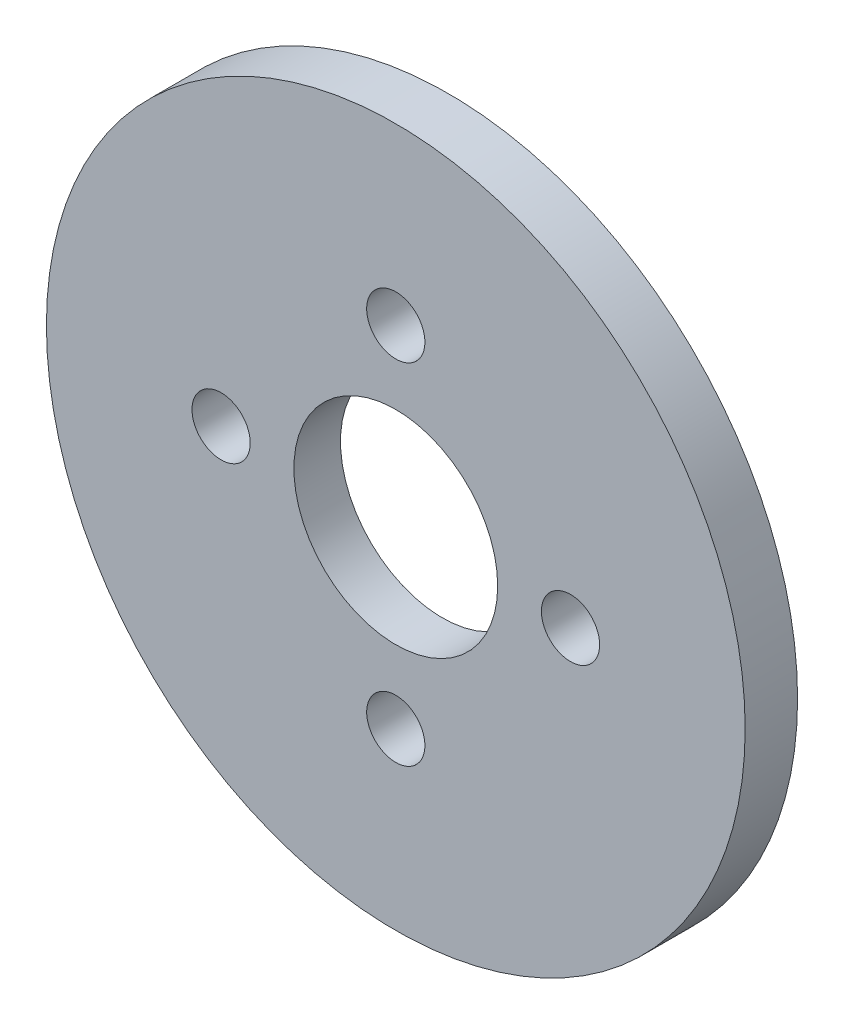
ISO-10303-21;
HEADER;
FILE_DESCRIPTION(('STEP AP214'),'2;1');
FILE_NAME('part.step','',(''),(''),'','','');
FILE_SCHEMA(('AUTOMOTIVE_DESIGN { 1 0 10303 214 1 1 1 1 }'));
ENDSEC;
DATA;
#1=APPLICATION_CONTEXT('core data for automotive mechanical design processes');
#2=APPLICATION_PROTOCOL_DEFINITION('international standard','automotive_design',2000,#1);
#3=PRODUCT_CONTEXT('',#1,'mechanical');
#4=PRODUCT('Part','Part','',(#3));
#5=PRODUCT_RELATED_PRODUCT_CATEGORY('part','',(#4));
#6=PRODUCT_DEFINITION_FORMATION('','',#4);
#7=PRODUCT_DEFINITION_CONTEXT('part definition',#1,'design');
#8=PRODUCT_DEFINITION('design','',#6,#7);
#9=PRODUCT_DEFINITION_SHAPE('','',#8);
#10=(LENGTH_UNIT() NAMED_UNIT(*) SI_UNIT(.MILLI.,.METRE.));
#11=(NAMED_UNIT(*) PLANE_ANGLE_UNIT() SI_UNIT($,.RADIAN.));
#12=(NAMED_UNIT(*) SI_UNIT($,.STERADIAN.) SOLID_ANGLE_UNIT());
#13=UNCERTAINTY_MEASURE_WITH_UNIT(LENGTH_MEASURE(1.E-05),#10,'distance_accuracy_value','');
#14=(GEOMETRIC_REPRESENTATION_CONTEXT(3) GLOBAL_UNCERTAINTY_ASSIGNED_CONTEXT((#13)) GLOBAL_UNIT_ASSIGNED_CONTEXT((#10,
#11,#12)) REPRESENTATION_CONTEXT('',''));
#15=CARTESIAN_POINT('',(0.,0.,0.));
#16=DIRECTION('',(0.,0.,1.));
#17=DIRECTION('',(1.,0.,0.));
#18=AXIS2_PLACEMENT_3D('',#15,#16,#17);
#19=CARTESIAN_POINT('',(0.,0.,0.));
#20=DIRECTION('',(0.,0.,1.));
#21=DIRECTION('',(1.,0.,0.));
#22=AXIS2_PLACEMENT_3D('',#19,#20,#21);
#23=PLANE('',#22);
#24=CARTESIAN_POINT('',(0.,15.,0.));
#25=DIRECTION('',(0.,0.,1.));
#26=DIRECTION('',(1.,0.,0.));
#27=AXIS2_PLACEMENT_3D('',#24,#25,#26);
#28=CIRCLE('',#27,2.5);
#29=CARTESIAN_POINT('',(2.5,15.,0.));
#30=VERTEX_POINT('',#29);
#31=EDGE_CURVE('E92',#30,#30,#28,.T.);
#32=ORIENTED_EDGE('',*,*,#31,.T.);
#33=EDGE_LOOP('',(#32));
#34=FACE_BOUND('',#33,.T.);
#35=CARTESIAN_POINT('',(15.,0.,0.));
#36=DIRECTION('',(0.,0.,1.));
#37=DIRECTION('',(1.,0.,0.));
#38=AXIS2_PLACEMENT_3D('',#35,#36,#37);
#39=CIRCLE('',#38,2.5);
#40=CARTESIAN_POINT('',(17.5,0.,0.));
#41=VERTEX_POINT('',#40);
#42=EDGE_CURVE('E96',#41,#41,#39,.T.);
#43=ORIENTED_EDGE('',*,*,#42,.T.);
#44=EDGE_LOOP('',(#43));
#45=FACE_BOUND('',#44,.T.);
#46=CARTESIAN_POINT('',(0.,-15.,0.));
#47=DIRECTION('',(0.,0.,1.));
#48=DIRECTION('',(1.,0.,0.));
#49=AXIS2_PLACEMENT_3D('',#46,#47,#48);
#50=CIRCLE('',#49,2.5);
#51=CARTESIAN_POINT('',(2.5,-15.,0.));
#52=VERTEX_POINT('',#51);
#53=EDGE_CURVE('E100',#52,#52,#50,.T.);
#54=ORIENTED_EDGE('',*,*,#53,.T.);
#55=EDGE_LOOP('',(#54));
#56=FACE_BOUND('',#55,.T.);
#57=CARTESIAN_POINT('',(-15.,0.,0.));
#58=DIRECTION('',(0.,0.,1.));
#59=DIRECTION('',(1.,0.,0.));
#60=AXIS2_PLACEMENT_3D('',#57,#58,#59);
#61=CIRCLE('',#60,2.5);
#62=CARTESIAN_POINT('',(-12.5,0.,0.));
#63=VERTEX_POINT('',#62);
#64=EDGE_CURVE('E53',#63,#63,#61,.T.);
#65=ORIENTED_EDGE('',*,*,#64,.T.);
#66=EDGE_LOOP('',(#65));
#67=FACE_BOUND('',#66,.T.);
#68=CARTESIAN_POINT('',(0.,0.,0.));
#69=DIRECTION('',(0.,0.,1.));
#70=DIRECTION('',(1.,0.,0.));
#71=AXIS2_PLACEMENT_3D('',#68,#69,#70);
#72=CIRCLE('',#71,8.75);
#73=CARTESIAN_POINT('',(8.75,0.,0.));
#74=VERTEX_POINT('',#73);
#75=EDGE_CURVE('E61',#74,#74,#72,.T.);
#76=ORIENTED_EDGE('',*,*,#75,.T.);
#77=EDGE_LOOP('',(#76));
#78=FACE_BOUND('',#77,.T.);
#79=CARTESIAN_POINT('',(0.,0.,0.));
#80=DIRECTION('',(0.,0.,1.));
#81=DIRECTION('',(1.,0.,0.));
#82=AXIS2_PLACEMENT_3D('',#79,#80,#81);
#83=CIRCLE('',#82,18.);
#84=CARTESIAN_POINT('',(18.,0.,0.));
#85=VERTEX_POINT('',#84);
#86=EDGE_CURVE('E10',#85,#85,#83,.T.);
#87=ORIENTED_EDGE('',*,*,#86,.F.);
#88=EDGE_LOOP('',(#87));
#89=FACE_BOUND('',#88,.T.);
#90=ADVANCED_FACE('F38',(#34,#45,#56,#67,#78,#89),#23,.F.);
#91=CARTESIAN_POINT('',(0.,0.,4.));
#92=DIRECTION('',(0.,0.,1.));
#93=DIRECTION('',(1.,0.,0.));
#94=AXIS2_PLACEMENT_3D('',#91,#92,#93);
#95=PLANE('',#94);
#96=CARTESIAN_POINT('',(0.,15.,4.));
#97=DIRECTION('',(0.,0.,1.));
#98=DIRECTION('',(1.,0.,0.));
#99=AXIS2_PLACEMENT_3D('',#96,#97,#98);
#100=CIRCLE('',#99,2.5);
#101=CARTESIAN_POINT('',(2.5,15.,4.));
#102=VERTEX_POINT('',#101);
#103=EDGE_CURVE('E118',#102,#102,#100,.T.);
#104=ORIENTED_EDGE('',*,*,#103,.F.);
#105=EDGE_LOOP('',(#104));
#106=FACE_BOUND('',#105,.T.);
#107=CARTESIAN_POINT('',(15.,0.,4.));
#108=DIRECTION('',(0.,0.,1.));
#109=DIRECTION('',(1.,0.,0.));
#110=AXIS2_PLACEMENT_3D('',#107,#108,#109);
#111=CIRCLE('',#110,2.5);
#112=CARTESIAN_POINT('',(17.5,0.,4.));
#113=VERTEX_POINT('',#112);
#114=EDGE_CURVE('E114',#113,#113,#111,.T.);
#115=ORIENTED_EDGE('',*,*,#114,.F.);
#116=EDGE_LOOP('',(#115));
#117=FACE_BOUND('',#116,.T.);
#118=CARTESIAN_POINT('',(0.,-15.,4.));
#119=DIRECTION('',(0.,0.,1.));
#120=DIRECTION('',(1.,0.,0.));
#121=AXIS2_PLACEMENT_3D('',#118,#119,#120);
#122=CIRCLE('',#121,2.5);
#123=CARTESIAN_POINT('',(2.5,-15.,4.));
#124=VERTEX_POINT('',#123);
#125=EDGE_CURVE('E108',#124,#124,#122,.T.);
#126=ORIENTED_EDGE('',*,*,#125,.F.);
#127=EDGE_LOOP('',(#126));
#128=FACE_BOUND('',#127,.T.);
#129=CARTESIAN_POINT('',(-15.,0.,4.));
#130=DIRECTION('',(0.,0.,1.));
#131=DIRECTION('',(1.,0.,0.));
#132=AXIS2_PLACEMENT_3D('',#129,#130,#131);
#133=CIRCLE('',#132,2.5);
#134=CARTESIAN_POINT('',(-12.5,0.,4.));
#135=VERTEX_POINT('',#134);
#136=EDGE_CURVE('E104',#135,#135,#133,.T.);
#137=ORIENTED_EDGE('',*,*,#136,.F.);
#138=EDGE_LOOP('',(#137));
#139=FACE_BOUND('',#138,.T.);
#140=CARTESIAN_POINT('',(0.,0.,4.));
#141=DIRECTION('',(0.,0.,1.));
#142=DIRECTION('',(1.,0.,0.));
#143=AXIS2_PLACEMENT_3D('',#140,#141,#142);
#144=CIRCLE('',#143,30.);
#145=CARTESIAN_POINT('',(30.,0.,4.));
#146=VERTEX_POINT('',#145);
#147=EDGE_CURVE('E42',#146,#146,#144,.T.);
#148=ORIENTED_EDGE('',*,*,#147,.T.);
#149=EDGE_LOOP('',(#148));
#150=FACE_BOUND('',#149,.T.);
#151=CARTESIAN_POINT('',(0.,0.,4.));
#152=DIRECTION('',(0.,0.,1.));
#153=DIRECTION('',(1.,0.,0.));
#154=AXIS2_PLACEMENT_3D('',#151,#152,#153);
#155=CIRCLE('',#154,8.75);
#156=CARTESIAN_POINT('',(8.75,0.,4.));
#157=VERTEX_POINT('',#156);
#158=EDGE_CURVE('E50',#157,#157,#155,.T.);
#159=ORIENTED_EDGE('',*,*,#158,.F.);
#160=EDGE_LOOP('',(#159));
#161=FACE_BOUND('',#160,.T.);
#162=ADVANCED_FACE('F80',(#106,#117,#128,#139,#150,#161),#95,.T.);
#163=CARTESIAN_POINT('',(0.,0.,4.));
#164=DIRECTION('',(0.,0.,-1.));
#165=DIRECTION('',(-1.,0.,0.));
#166=AXIS2_PLACEMENT_3D('',#163,#164,#165);
#167=CYLINDRICAL_SURFACE('',#166,30.);
#168=ORIENTED_EDGE('',*,*,#147,.F.);
#169=EDGE_LOOP('',(#168));
#170=FACE_BOUND('',#169,.T.);
#171=CARTESIAN_POINT('',(0.,0.,-0.5));
#172=DIRECTION('',(0.,0.,1.));
#173=DIRECTION('',(1.,0.,0.));
#174=AXIS2_PLACEMENT_3D('',#171,#172,#173);
#175=CIRCLE('',#174,30.);
#176=CARTESIAN_POINT('',(30.,0.,-0.5));
#177=VERTEX_POINT('',#176);
#178=EDGE_CURVE('E58',#177,#177,#175,.T.);
#179=ORIENTED_EDGE('',*,*,#178,.T.);
#180=EDGE_LOOP('',(#179));
#181=FACE_BOUND('',#180,.T.);
#182=ADVANCED_FACE('F40',(#170,#181),#167,.T.);
#183=CARTESIAN_POINT('',(0.,0.,4.));
#184=DIRECTION('',(0.,0.,-1.));
#185=DIRECTION('',(-1.,0.,0.));
#186=AXIS2_PLACEMENT_3D('',#183,#184,#185);
#187=CYLINDRICAL_SURFACE('',#186,8.75);
#188=ORIENTED_EDGE('',*,*,#158,.T.);
#189=EDGE_LOOP('',(#188));
#190=FACE_BOUND('',#189,.T.);
#191=ORIENTED_EDGE('',*,*,#75,.F.);
#192=EDGE_LOOP('',(#191));
#193=FACE_BOUND('',#192,.T.);
#194=ADVANCED_FACE('F68',(#190,#193),#187,.F.);
#195=CARTESIAN_POINT('',(-30.,0.,-0.5));
#196=DIRECTION('',(0.,0.,1.));
#197=DIRECTION('',(1.,0.,0.));
#198=AXIS2_PLACEMENT_3D('',#195,#196,#197);
#199=PLANE('',#198);
#200=ORIENTED_EDGE('',*,*,#178,.F.);
#201=EDGE_LOOP('',(#200));
#202=FACE_BOUND('',#201,.T.);
#203=CARTESIAN_POINT('',(0.,0.,-0.5));
#204=DIRECTION('',(0.,0.,1.));
#205=DIRECTION('',(1.,0.,0.));
#206=AXIS2_PLACEMENT_3D('',#203,#204,#205);
#207=CIRCLE('',#206,20.);
#208=CARTESIAN_POINT('',(20.,0.,-0.5));
#209=VERTEX_POINT('',#208);
#210=EDGE_CURVE('E55',#209,#209,#207,.T.);
#211=ORIENTED_EDGE('',*,*,#210,.T.);
#212=EDGE_LOOP('',(#211));
#213=FACE_BOUND('',#212,.T.);
#214=ADVANCED_FACE('F70',(#202,#213),#199,.F.);
#215=CARTESIAN_POINT('',(0.,0.,0.));
#216=DIRECTION('',(0.,0.,-1.));
#217=DIRECTION('',(-1.,0.,0.));
#218=AXIS2_PLACEMENT_3D('',#215,#216,#217);
#219=CONICAL_SURFACE('',#218,18.,1.32581766366803);
#220=ORIENTED_EDGE('',*,*,#210,.F.);
#221=EDGE_LOOP('',(#220));
#222=FACE_BOUND('',#221,.T.);
#223=ORIENTED_EDGE('',*,*,#86,.T.);
#224=EDGE_LOOP('',(#223));
#225=FACE_BOUND('',#224,.T.);
#226=ADVANCED_FACE('F77',(#222,#225),#219,.F.);
#227=CARTESIAN_POINT('',(-15.,0.,4.));
#228=DIRECTION('',(0.,0.,1.));
#229=DIRECTION('',(1.,0.,0.));
#230=AXIS2_PLACEMENT_3D('',#227,#228,#229);
#231=CYLINDRICAL_SURFACE('',#230,2.5);
#232=ORIENTED_EDGE('',*,*,#136,.T.);
#233=EDGE_LOOP('',(#232));
#234=FACE_BOUND('',#233,.T.);
#235=ORIENTED_EDGE('',*,*,#64,.F.);
#236=EDGE_LOOP('',(#235));
#237=FACE_BOUND('',#236,.T.);
#238=ADVANCED_FACE('F139',(#234,#237),#231,.F.);
#239=CARTESIAN_POINT('',(0.,-15.,4.));
#240=DIRECTION('',(0.,0.,1.));
#241=DIRECTION('',(1.,0.,0.));
#242=AXIS2_PLACEMENT_3D('',#239,#240,#241);
#243=CYLINDRICAL_SURFACE('',#242,2.5);
#244=ORIENTED_EDGE('',*,*,#125,.T.);
#245=EDGE_LOOP('',(#244));
#246=FACE_BOUND('',#245,.T.);
#247=ORIENTED_EDGE('',*,*,#53,.F.);
#248=EDGE_LOOP('',(#247));
#249=FACE_BOUND('',#248,.T.);
#250=ADVANCED_FACE('F145',(#246,#249),#243,.F.);
#251=CARTESIAN_POINT('',(15.,0.,4.));
#252=DIRECTION('',(0.,0.,1.));
#253=DIRECTION('',(1.,0.,0.));
#254=AXIS2_PLACEMENT_3D('',#251,#252,#253);
#255=CYLINDRICAL_SURFACE('',#254,2.5);
#256=ORIENTED_EDGE('',*,*,#114,.T.);
#257=EDGE_LOOP('',(#256));
#258=FACE_BOUND('',#257,.T.);
#259=ORIENTED_EDGE('',*,*,#42,.F.);
#260=EDGE_LOOP('',(#259));
#261=FACE_BOUND('',#260,.T.);
#262=ADVANCED_FACE('F150',(#258,#261),#255,.F.);
#263=CARTESIAN_POINT('',(0.,15.,4.));
#264=DIRECTION('',(0.,0.,1.));
#265=DIRECTION('',(1.,0.,0.));
#266=AXIS2_PLACEMENT_3D('',#263,#264,#265);
#267=CYLINDRICAL_SURFACE('',#266,2.5);
#268=ORIENTED_EDGE('',*,*,#103,.T.);
#269=EDGE_LOOP('',(#268));
#270=FACE_BOUND('',#269,.T.);
#271=ORIENTED_EDGE('',*,*,#31,.F.);
#272=EDGE_LOOP('',(#271));
#273=FACE_BOUND('',#272,.T.);
#274=ADVANCED_FACE('F122',(#270,#273),#267,.F.);
#275=CLOSED_SHELL('',(#90,#162,#182,#194,#214,#226,#238,#250,#262,#274));
#276=MANIFOLD_SOLID_BREP('B2',#275);
#277=ADVANCED_BREP_SHAPE_REPRESENTATION('',(#18,#276),#14);
#278=SHAPE_DEFINITION_REPRESENTATION(#9,#277);
ENDSEC;
END-ISO-10303-21;
